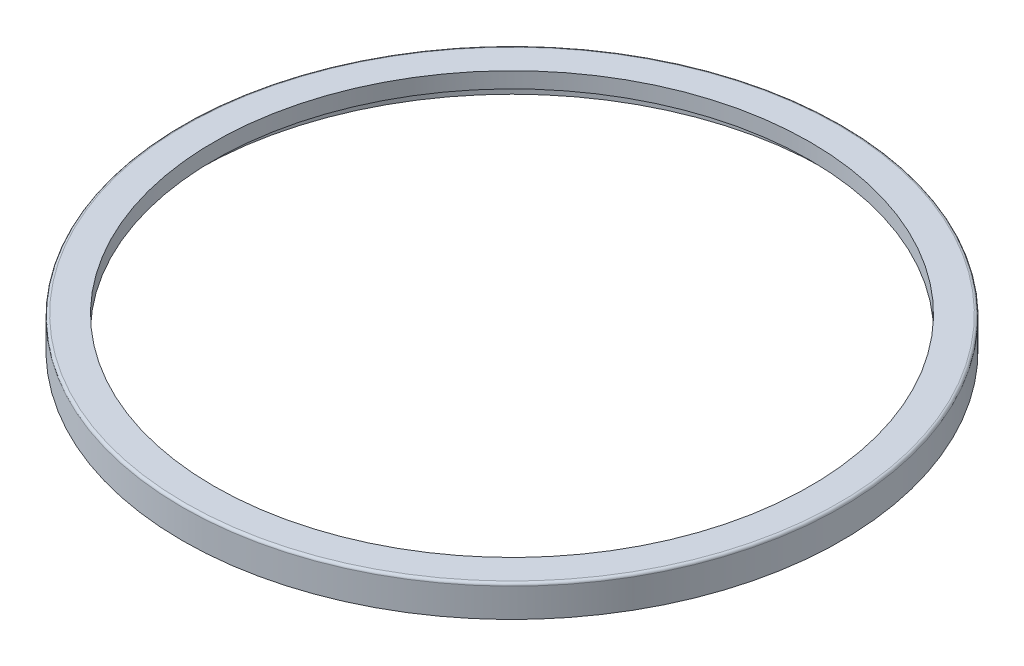
ISO-10303-21;
HEADER;
FILE_DESCRIPTION(('STEP AP214'),'2;1');
FILE_NAME('part.step','',(''),(''),'','','');
FILE_SCHEMA(('AUTOMOTIVE_DESIGN { 1 0 10303 214 1 1 1 1 }'));
ENDSEC;
DATA;
#1=APPLICATION_CONTEXT('core data for automotive mechanical design processes');
#2=APPLICATION_PROTOCOL_DEFINITION('international standard','automotive_design',2000,#1);
#3=PRODUCT_CONTEXT('',#1,'mechanical');
#4=PRODUCT('Part','Part','',(#3));
#5=PRODUCT_RELATED_PRODUCT_CATEGORY('part','',(#4));
#6=PRODUCT_DEFINITION_FORMATION('','',#4);
#7=PRODUCT_DEFINITION_CONTEXT('part definition',#1,'design');
#8=PRODUCT_DEFINITION('design','',#6,#7);
#9=PRODUCT_DEFINITION_SHAPE('','',#8);
#10=(LENGTH_UNIT() NAMED_UNIT(*) SI_UNIT(.MILLI.,.METRE.));
#11=(NAMED_UNIT(*) PLANE_ANGLE_UNIT() SI_UNIT($,.RADIAN.));
#12=(NAMED_UNIT(*) SI_UNIT($,.STERADIAN.) SOLID_ANGLE_UNIT());
#13=UNCERTAINTY_MEASURE_WITH_UNIT(LENGTH_MEASURE(1.E-05),#10,'distance_accuracy_value','');
#14=(GEOMETRIC_REPRESENTATION_CONTEXT(3) GLOBAL_UNCERTAINTY_ASSIGNED_CONTEXT((#13)) GLOBAL_UNIT_ASSIGNED_CONTEXT((#10,
#11,#12)) REPRESENTATION_CONTEXT('',''));
#15=CARTESIAN_POINT('',(0.,0.,0.));
#16=DIRECTION('',(0.,0.,1.));
#17=DIRECTION('',(1.,0.,0.));
#18=AXIS2_PLACEMENT_3D('',#15,#16,#17);
#19=CARTESIAN_POINT('',(0.,0.,0.));
#20=DIRECTION('',(0.,-1.,0.));
#21=DIRECTION('',(0.,0.,-1.));
#22=AXIS2_PLACEMENT_3D('',#19,#20,#21);
#23=CYLINDRICAL_SURFACE('',#22,57.7215);
#24=CARTESIAN_POINT('',(0.,0.,0.));
#25=DIRECTION('',(0.,-1.,0.));
#26=DIRECTION('',(0.,0.,-1.));
#27=AXIS2_PLACEMENT_3D('',#24,#25,#26);
#28=CIRCLE('',#27,57.7215);
#29=CARTESIAN_POINT('',(0.,0.,-57.7215));
#30=VERTEX_POINT('',#29);
#31=EDGE_CURVE('E55',#30,#30,#28,.T.);
#32=ORIENTED_EDGE('',*,*,#31,.F.);
#33=EDGE_LOOP('',(#32));
#34=FACE_BOUND('',#33,.T.);
#35=CARTESIAN_POINT('',(0.,-3.048,0.));
#36=DIRECTION('',(0.,-1.,0.));
#37=DIRECTION('',(0.,0.,-1.));
#38=AXIS2_PLACEMENT_3D('',#35,#36,#37);
#39=CIRCLE('',#38,57.7215);
#40=CARTESIAN_POINT('',(0.,-3.048,-57.7215));
#41=VERTEX_POINT('',#40);
#42=EDGE_CURVE('E64',#41,#41,#39,.T.);
#43=ORIENTED_EDGE('',*,*,#42,.T.);
#44=EDGE_LOOP('',(#43));
#45=FACE_BOUND('',#44,.T.);
#46=ADVANCED_FACE('F32',(#34,#45),#23,.F.);
#47=CARTESIAN_POINT('',(-57.7215,0.,0.));
#48=DIRECTION('',(0.,-1.,0.));
#49=DIRECTION('',(0.,0.,-1.));
#50=AXIS2_PLACEMENT_3D('',#47,#48,#49);
#51=PLANE('',#50);
#52=CARTESIAN_POINT('',(0.,0.,0.));
#53=DIRECTION('',(0.,-1.,0.));
#54=DIRECTION('',(0.,0.,-1.));
#55=AXIS2_PLACEMENT_3D('',#52,#53,#54);
#56=CIRCLE('',#55,63.3095);
#57=CARTESIAN_POINT('',(0.,0.,-63.3095));
#58=VERTEX_POINT('',#57);
#59=EDGE_CURVE('E10',#58,#58,#56,.F.);
#60=ORIENTED_EDGE('',*,*,#59,.T.);
#61=EDGE_LOOP('',(#60));
#62=FACE_BOUND('',#61,.T.);
#63=ORIENTED_EDGE('',*,*,#31,.T.);
#64=EDGE_LOOP('',(#63));
#65=FACE_BOUND('',#64,.T.);
#66=ADVANCED_FACE('F84',(#62,#65),#51,.F.);
#67=CARTESIAN_POINT('',(0.,0.,0.));
#68=DIRECTION('',(0.,-1.,0.));
#69=DIRECTION('',(0.,0.,-1.));
#70=AXIS2_PLACEMENT_3D('',#67,#68,#69);
#71=CYLINDRICAL_SURFACE('',#70,63.8175);
#72=CARTESIAN_POINT('',(0.,-0.508,0.));
#73=DIRECTION('',(0.,-1.,0.));
#74=DIRECTION('',(0.,0.,-1.));
#75=AXIS2_PLACEMENT_3D('',#72,#73,#74);
#76=CIRCLE('',#75,63.8175);
#77=CARTESIAN_POINT('',(0.,-0.508,-63.8175));
#78=VERTEX_POINT('',#77);
#79=EDGE_CURVE('E40',#78,#78,#76,.T.);
#80=ORIENTED_EDGE('',*,*,#79,.T.);
#81=EDGE_LOOP('',(#80));
#82=FACE_BOUND('',#81,.T.);
#83=CARTESIAN_POINT('',(0.,-6.096,0.));
#84=DIRECTION('',(0.,-1.,0.));
#85=DIRECTION('',(0.,0.,-1.));
#86=AXIS2_PLACEMENT_3D('',#83,#84,#85);
#87=CIRCLE('',#86,63.8175);
#88=CARTESIAN_POINT('',(0.,-6.096,-63.8175));
#89=VERTEX_POINT('',#88);
#90=EDGE_CURVE('E58',#89,#89,#87,.T.);
#91=ORIENTED_EDGE('',*,*,#90,.F.);
#92=EDGE_LOOP('',(#91));
#93=FACE_BOUND('',#92,.T.);
#94=ADVANCED_FACE('F90',(#82,#93),#71,.T.);
#95=CARTESIAN_POINT('',(-63.8175,-6.096,0.));
#96=DIRECTION('',(0.,1.,0.));
#97=DIRECTION('',(0.,0.,1.));
#98=AXIS2_PLACEMENT_3D('',#95,#96,#97);
#99=PLANE('',#98);
#100=CARTESIAN_POINT('',(0.,-6.096,0.));
#101=DIRECTION('',(0.,-1.,0.));
#102=DIRECTION('',(0.,0.,-1.));
#103=AXIS2_PLACEMENT_3D('',#100,#101,#102);
#104=CIRCLE('',#103,60.7695);
#105=CARTESIAN_POINT('',(0.,-6.096,-60.7695));
#106=VERTEX_POINT('',#105);
#107=EDGE_CURVE('E61',#106,#106,#104,.T.);
#108=ORIENTED_EDGE('',*,*,#107,.F.);
#109=EDGE_LOOP('',(#108));
#110=FACE_BOUND('',#109,.T.);
#111=ORIENTED_EDGE('',*,*,#90,.T.);
#112=EDGE_LOOP('',(#111));
#113=FACE_BOUND('',#112,.T.);
#114=ADVANCED_FACE('F80',(#110,#113),#99,.F.);
#115=CARTESIAN_POINT('',(0.,0.,0.));
#116=DIRECTION('',(0.,-1.,0.));
#117=DIRECTION('',(0.,0.,-1.));
#118=AXIS2_PLACEMENT_3D('',#115,#116,#117);
#119=CYLINDRICAL_SURFACE('',#118,60.7695);
#120=CARTESIAN_POINT('',(0.,-4.6355,0.));
#121=DIRECTION('',(0.,1.,0.));
#122=DIRECTION('',(0.,0.,1.));
#123=AXIS2_PLACEMENT_3D('',#120,#121,#122);
#124=CIRCLE('',#123,60.7695);
#125=CARTESIAN_POINT('',(0.,-4.6355,60.7695));
#126=VERTEX_POINT('',#125);
#127=EDGE_CURVE('E46',#126,#126,#124,.T.);
#128=ORIENTED_EDGE('',*,*,#127,.T.);
#129=EDGE_LOOP('',(#128));
#130=FACE_BOUND('',#129,.T.);
#131=ORIENTED_EDGE('',*,*,#107,.T.);
#132=EDGE_LOOP('',(#131));
#133=FACE_BOUND('',#132,.T.);
#134=ADVANCED_FACE('F72',(#130,#133),#119,.F.);
#135=CARTESIAN_POINT('',(-60.7695,-3.048,0.));
#136=DIRECTION('',(0.,1.,0.));
#137=DIRECTION('',(0.,0.,1.));
#138=AXIS2_PLACEMENT_3D('',#135,#136,#137);
#139=PLANE('',#138);
#140=CARTESIAN_POINT('',(0.,-3.048,0.));
#141=DIRECTION('',(0.,1.,0.));
#142=DIRECTION('',(0.,0.,1.));
#143=AXIS2_PLACEMENT_3D('',#140,#141,#142);
#144=CIRCLE('',#143,59.182);
#145=CARTESIAN_POINT('',(0.,-3.048,59.182));
#146=VERTEX_POINT('',#145);
#147=EDGE_CURVE('E50',#146,#146,#144,.F.);
#148=ORIENTED_EDGE('',*,*,#147,.T.);
#149=EDGE_LOOP('',(#148));
#150=FACE_BOUND('',#149,.T.);
#151=ORIENTED_EDGE('',*,*,#42,.F.);
#152=EDGE_LOOP('',(#151));
#153=FACE_BOUND('',#152,.T.);
#154=ADVANCED_FACE('F69',(#150,#153),#139,.F.);
#155=CARTESIAN_POINT('',(0.,-4.6355,0.));
#156=DIRECTION('',(0.,1.,0.));
#157=DIRECTION('',(0.,0.,1.));
#158=AXIS2_PLACEMENT_3D('',#155,#156,#157);
#159=TOROIDAL_SURFACE('',#158,59.182,1.5875);
#160=ORIENTED_EDGE('',*,*,#127,.F.);
#161=EDGE_LOOP('',(#160));
#162=FACE_BOUND('',#161,.T.);
#163=ORIENTED_EDGE('',*,*,#147,.F.);
#164=EDGE_LOOP('',(#163));
#165=FACE_BOUND('',#164,.T.);
#166=ADVANCED_FACE('F71',(#162,#165),#159,.F.);
#167=CARTESIAN_POINT('',(0.,-0.508,0.));
#168=DIRECTION('',(0.,-1.,0.));
#169=DIRECTION('',(0.,0.,-1.));
#170=AXIS2_PLACEMENT_3D('',#167,#168,#169);
#171=TOROIDAL_SURFACE('',#170,63.3095,0.508);
#172=ORIENTED_EDGE('',*,*,#59,.F.);
#173=EDGE_LOOP('',(#172));
#174=FACE_BOUND('',#173,.T.);
#175=ORIENTED_EDGE('',*,*,#79,.F.);
#176=EDGE_LOOP('',(#175));
#177=FACE_BOUND('',#176,.T.);
#178=ADVANCED_FACE('F34',(#174,#177),#171,.T.);
#179=CLOSED_SHELL('',(#46,#66,#94,#114,#134,#154,#166,#178));
#180=MANIFOLD_SOLID_BREP('B2',#179);
#181=ADVANCED_BREP_SHAPE_REPRESENTATION('',(#18,#180),#14);
#182=SHAPE_DEFINITION_REPRESENTATION(#9,#181);
ENDSEC;
END-ISO-10303-21;
